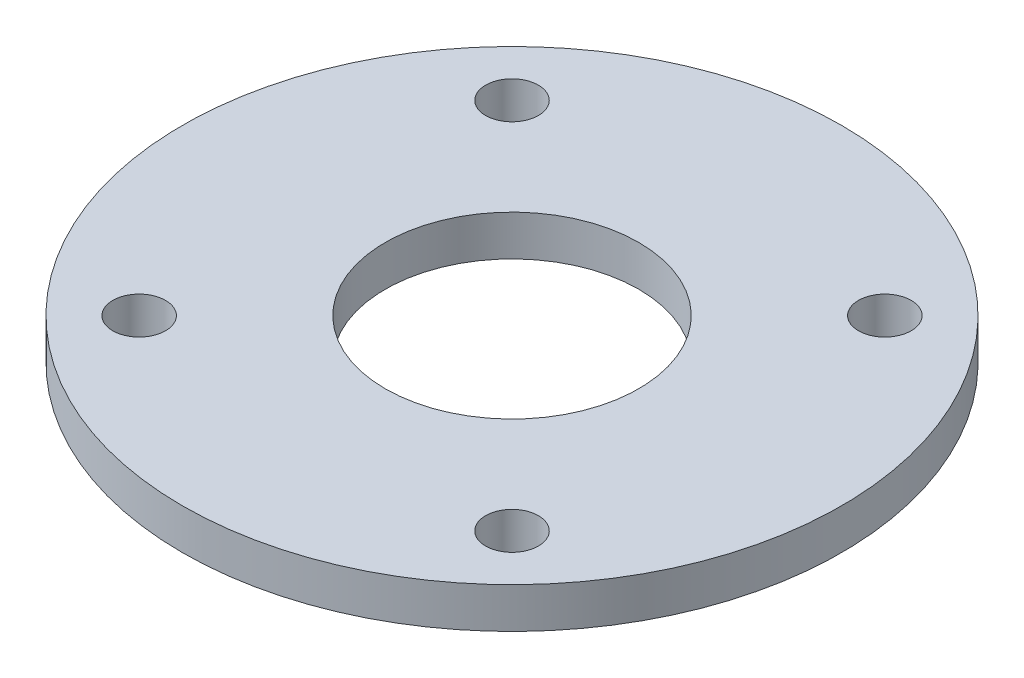
ISO-10303-21;
HEADER;
FILE_DESCRIPTION(('STEP AP214'),'2;1');
FILE_NAME('part.step','',(''),(''),'','','');
FILE_SCHEMA(('AUTOMOTIVE_DESIGN { 1 0 10303 214 1 1 1 1 }'));
ENDSEC;
DATA;
#1=APPLICATION_CONTEXT('core data for automotive mechanical design processes');
#2=APPLICATION_PROTOCOL_DEFINITION('international standard','automotive_design',2000,#1);
#3=PRODUCT_CONTEXT('',#1,'mechanical');
#4=PRODUCT('Part','Part','',(#3));
#5=PRODUCT_RELATED_PRODUCT_CATEGORY('part','',(#4));
#6=PRODUCT_DEFINITION_FORMATION('','',#4);
#7=PRODUCT_DEFINITION_CONTEXT('part definition',#1,'design');
#8=PRODUCT_DEFINITION('design','',#6,#7);
#9=PRODUCT_DEFINITION_SHAPE('','',#8);
#10=(LENGTH_UNIT() NAMED_UNIT(*) SI_UNIT(.MILLI.,.METRE.));
#11=(NAMED_UNIT(*) PLANE_ANGLE_UNIT() SI_UNIT($,.RADIAN.));
#12=(NAMED_UNIT(*) SI_UNIT($,.STERADIAN.) SOLID_ANGLE_UNIT());
#13=UNCERTAINTY_MEASURE_WITH_UNIT(LENGTH_MEASURE(1.E-05),#10,'distance_accuracy_value','');
#14=(GEOMETRIC_REPRESENTATION_CONTEXT(3) GLOBAL_UNCERTAINTY_ASSIGNED_CONTEXT((#13)) GLOBAL_UNIT_ASSIGNED_CONTEXT((#10,
#11,#12)) REPRESENTATION_CONTEXT('',''));
#15=CARTESIAN_POINT('',(0.,0.,0.));
#16=DIRECTION('',(0.,0.,1.));
#17=DIRECTION('',(1.,0.,0.));
#18=AXIS2_PLACEMENT_3D('',#15,#16,#17);
#19=CARTESIAN_POINT('',(0.,4.,0.));
#20=DIRECTION('',(0.,1.,0.));
#21=DIRECTION('',(0.,0.,1.));
#22=AXIS2_PLACEMENT_3D('',#19,#20,#21);
#23=PLANE('',#22);
#24=CARTESIAN_POINT('',(-18.3847763108502,4.,-18.3847763108502));
#25=DIRECTION('',(0.,1.,0.));
#26=DIRECTION('',(0.,0.,1.));
#27=AXIS2_PLACEMENT_3D('',#24,#25,#26);
#28=CIRCLE('',#27,2.6);
#29=CARTESIAN_POINT('',(-18.3847763108502,4.,-15.7847763108502));
#30=VERTEX_POINT('',#29);
#31=EDGE_CURVE('E61',#30,#30,#28,.T.);
#32=ORIENTED_EDGE('',*,*,#31,.F.);
#33=EDGE_LOOP('',(#32));
#34=FACE_BOUND('',#33,.T.);
#35=CARTESIAN_POINT('',(18.3847763108502,4.,18.3847763108502));
#36=DIRECTION('',(0.,1.,0.));
#37=DIRECTION('',(0.,0.,1.));
#38=AXIS2_PLACEMENT_3D('',#35,#36,#37);
#39=CIRCLE('',#38,2.6);
#40=CARTESIAN_POINT('',(18.3847763108502,4.,20.9847763108502));
#41=VERTEX_POINT('',#40);
#42=EDGE_CURVE('E49',#41,#41,#39,.T.);
#43=ORIENTED_EDGE('',*,*,#42,.F.);
#44=EDGE_LOOP('',(#43));
#45=FACE_BOUND('',#44,.T.);
#46=CARTESIAN_POINT('',(0.,4.,0.));
#47=DIRECTION('',(0.,1.,0.));
#48=DIRECTION('',(0.,0.,1.));
#49=AXIS2_PLACEMENT_3D('',#46,#47,#48);
#50=CIRCLE('',#49,32.5);
#51=CARTESIAN_POINT('',(0.,4.,32.5));
#52=VERTEX_POINT('',#51);
#53=EDGE_CURVE('E10',#52,#52,#50,.T.);
#54=ORIENTED_EDGE('',*,*,#53,.T.);
#55=EDGE_LOOP('',(#54));
#56=FACE_BOUND('',#55,.T.);
#57=CARTESIAN_POINT('',(0.,4.,0.));
#58=DIRECTION('',(0.,1.,0.));
#59=DIRECTION('',(0.,0.,1.));
#60=AXIS2_PLACEMENT_3D('',#57,#58,#59);
#61=CIRCLE('',#60,12.5);
#62=CARTESIAN_POINT('',(0.,4.,12.5));
#63=VERTEX_POINT('',#62);
#64=EDGE_CURVE('E44',#63,#63,#61,.T.);
#65=ORIENTED_EDGE('',*,*,#64,.F.);
#66=EDGE_LOOP('',(#65));
#67=FACE_BOUND('',#66,.T.);
#68=CARTESIAN_POINT('',(-18.3847763108502,4.,18.3847763108502));
#69=DIRECTION('',(0.,1.,0.));
#70=DIRECTION('',(0.,0.,1.));
#71=AXIS2_PLACEMENT_3D('',#68,#69,#70);
#72=CIRCLE('',#71,2.6);
#73=CARTESIAN_POINT('',(-18.3847763108502,4.,20.9847763108502));
#74=VERTEX_POINT('',#73);
#75=EDGE_CURVE('E55',#74,#74,#72,.T.);
#76=ORIENTED_EDGE('',*,*,#75,.F.);
#77=EDGE_LOOP('',(#76));
#78=FACE_BOUND('',#77,.T.);
#79=CARTESIAN_POINT('',(18.3847763108502,4.,-18.3847763108502));
#80=DIRECTION('',(0.,1.,0.));
#81=DIRECTION('',(0.,0.,1.));
#82=AXIS2_PLACEMENT_3D('',#79,#80,#81);
#83=CIRCLE('',#82,2.6);
#84=CARTESIAN_POINT('',(18.3847763108502,4.,-15.7847763108502));
#85=VERTEX_POINT('',#84);
#86=EDGE_CURVE('E67',#85,#85,#83,.T.);
#87=ORIENTED_EDGE('',*,*,#86,.F.);
#88=EDGE_LOOP('',(#87));
#89=FACE_BOUND('',#88,.T.);
#90=ADVANCED_FACE('F33',(#34,#45,#56,#67,#78,#89),#23,.T.);
#91=CARTESIAN_POINT('',(0.,0.,0.));
#92=DIRECTION('',(0.,1.,0.));
#93=DIRECTION('',(0.,0.,1.));
#94=AXIS2_PLACEMENT_3D('',#91,#92,#93);
#95=PLANE('',#94);
#96=CARTESIAN_POINT('',(-18.3847763108502,0.,-18.3847763108502));
#97=DIRECTION('',(0.,1.,0.));
#98=DIRECTION('',(0.,0.,1.));
#99=AXIS2_PLACEMENT_3D('',#96,#97,#98);
#100=CIRCLE('',#99,2.6);
#101=CARTESIAN_POINT('',(-18.3847763108502,0.,-15.7847763108502));
#102=VERTEX_POINT('',#101);
#103=EDGE_CURVE('E64',#102,#102,#100,.T.);
#104=ORIENTED_EDGE('',*,*,#103,.T.);
#105=EDGE_LOOP('',(#104));
#106=FACE_BOUND('',#105,.T.);
#107=CARTESIAN_POINT('',(18.3847763108502,0.,18.3847763108502));
#108=DIRECTION('',(0.,1.,0.));
#109=DIRECTION('',(0.,0.,1.));
#110=AXIS2_PLACEMENT_3D('',#107,#108,#109);
#111=CIRCLE('',#110,2.6);
#112=CARTESIAN_POINT('',(18.3847763108502,0.,20.9847763108502));
#113=VERTEX_POINT('',#112);
#114=EDGE_CURVE('E52',#113,#113,#111,.T.);
#115=ORIENTED_EDGE('',*,*,#114,.T.);
#116=EDGE_LOOP('',(#115));
#117=FACE_BOUND('',#116,.T.);
#118=CARTESIAN_POINT('',(0.,0.,0.));
#119=DIRECTION('',(0.,1.,0.));
#120=DIRECTION('',(0.,0.,1.));
#121=AXIS2_PLACEMENT_3D('',#118,#119,#120);
#122=CIRCLE('',#121,32.5);
#123=CARTESIAN_POINT('',(0.,0.,32.5));
#124=VERTEX_POINT('',#123);
#125=EDGE_CURVE('E37',#124,#124,#122,.T.);
#126=ORIENTED_EDGE('',*,*,#125,.F.);
#127=EDGE_LOOP('',(#126));
#128=FACE_BOUND('',#127,.T.);
#129=CARTESIAN_POINT('',(0.,0.,0.));
#130=DIRECTION('',(0.,1.,0.));
#131=DIRECTION('',(0.,0.,1.));
#132=AXIS2_PLACEMENT_3D('',#129,#130,#131);
#133=CIRCLE('',#132,12.5);
#134=CARTESIAN_POINT('',(0.,0.,12.5));
#135=VERTEX_POINT('',#134);
#136=EDGE_CURVE('E46',#135,#135,#133,.T.);
#137=ORIENTED_EDGE('',*,*,#136,.T.);
#138=EDGE_LOOP('',(#137));
#139=FACE_BOUND('',#138,.T.);
#140=CARTESIAN_POINT('',(-18.3847763108502,0.,18.3847763108502));
#141=DIRECTION('',(0.,1.,0.));
#142=DIRECTION('',(0.,0.,1.));
#143=AXIS2_PLACEMENT_3D('',#140,#141,#142);
#144=CIRCLE('',#143,2.6);
#145=CARTESIAN_POINT('',(-18.3847763108502,0.,20.9847763108502));
#146=VERTEX_POINT('',#145);
#147=EDGE_CURVE('E58',#146,#146,#144,.T.);
#148=ORIENTED_EDGE('',*,*,#147,.T.);
#149=EDGE_LOOP('',(#148));
#150=FACE_BOUND('',#149,.T.);
#151=CARTESIAN_POINT('',(18.3847763108502,0.,-18.3847763108502));
#152=DIRECTION('',(0.,1.,0.));
#153=DIRECTION('',(0.,0.,1.));
#154=AXIS2_PLACEMENT_3D('',#151,#152,#153);
#155=CIRCLE('',#154,2.6);
#156=CARTESIAN_POINT('',(18.3847763108502,0.,-15.7847763108502));
#157=VERTEX_POINT('',#156);
#158=EDGE_CURVE('E70',#157,#157,#155,.T.);
#159=ORIENTED_EDGE('',*,*,#158,.T.);
#160=EDGE_LOOP('',(#159));
#161=FACE_BOUND('',#160,.T.);
#162=ADVANCED_FACE('F80',(#106,#117,#128,#139,#150,#161),#95,.F.);
#163=CARTESIAN_POINT('',(0.,4.,0.));
#164=DIRECTION('',(0.,-1.,0.));
#165=DIRECTION('',(0.,0.,-1.));
#166=AXIS2_PLACEMENT_3D('',#163,#164,#165);
#167=CYLINDRICAL_SURFACE('',#166,32.5);
#168=ORIENTED_EDGE('',*,*,#53,.F.);
#169=EDGE_LOOP('',(#168));
#170=FACE_BOUND('',#169,.T.);
#171=ORIENTED_EDGE('',*,*,#125,.T.);
#172=EDGE_LOOP('',(#171));
#173=FACE_BOUND('',#172,.T.);
#174=ADVANCED_FACE('F35',(#170,#173),#167,.T.);
#175=CARTESIAN_POINT('',(0.,4.,0.));
#176=DIRECTION('',(0.,-1.,0.));
#177=DIRECTION('',(0.,0.,-1.));
#178=AXIS2_PLACEMENT_3D('',#175,#176,#177);
#179=CYLINDRICAL_SURFACE('',#178,12.5);
#180=ORIENTED_EDGE('',*,*,#64,.T.);
#181=EDGE_LOOP('',(#180));
#182=FACE_BOUND('',#181,.T.);
#183=ORIENTED_EDGE('',*,*,#136,.F.);
#184=EDGE_LOOP('',(#183));
#185=FACE_BOUND('',#184,.T.);
#186=ADVANCED_FACE('F90',(#182,#185),#179,.F.);
#187=CARTESIAN_POINT('',(18.3847763108502,4.,18.3847763108502));
#188=DIRECTION('',(0.,-1.,0.));
#189=DIRECTION('',(0.,0.,-1.));
#190=AXIS2_PLACEMENT_3D('',#187,#188,#189);
#191=CYLINDRICAL_SURFACE('',#190,2.6);
#192=ORIENTED_EDGE('',*,*,#42,.T.);
#193=EDGE_LOOP('',(#192));
#194=FACE_BOUND('',#193,.T.);
#195=ORIENTED_EDGE('',*,*,#114,.F.);
#196=EDGE_LOOP('',(#195));
#197=FACE_BOUND('',#196,.T.);
#198=ADVANCED_FACE('F93',(#194,#197),#191,.F.);
#199=CARTESIAN_POINT('',(-18.3847763108502,4.,18.3847763108502));
#200=DIRECTION('',(0.,-1.,0.));
#201=DIRECTION('',(0.,0.,-1.));
#202=AXIS2_PLACEMENT_3D('',#199,#200,#201);
#203=CYLINDRICAL_SURFACE('',#202,2.6);
#204=ORIENTED_EDGE('',*,*,#75,.T.);
#205=EDGE_LOOP('',(#204));
#206=FACE_BOUND('',#205,.T.);
#207=ORIENTED_EDGE('',*,*,#147,.F.);
#208=EDGE_LOOP('',(#207));
#209=FACE_BOUND('',#208,.T.);
#210=ADVANCED_FACE('F97',(#206,#209),#203,.F.);
#211=CARTESIAN_POINT('',(-18.3847763108502,4.,-18.3847763108502));
#212=DIRECTION('',(0.,-1.,0.));
#213=DIRECTION('',(0.,0.,-1.));
#214=AXIS2_PLACEMENT_3D('',#211,#212,#213);
#215=CYLINDRICAL_SURFACE('',#214,2.6);
#216=ORIENTED_EDGE('',*,*,#31,.T.);
#217=EDGE_LOOP('',(#216));
#218=FACE_BOUND('',#217,.T.);
#219=ORIENTED_EDGE('',*,*,#103,.F.);
#220=EDGE_LOOP('',(#219));
#221=FACE_BOUND('',#220,.T.);
#222=ADVANCED_FACE('F101',(#218,#221),#215,.F.);
#223=CARTESIAN_POINT('',(18.3847763108502,4.,-18.3847763108502));
#224=DIRECTION('',(0.,-1.,0.));
#225=DIRECTION('',(0.,0.,-1.));
#226=AXIS2_PLACEMENT_3D('',#223,#224,#225);
#227=CYLINDRICAL_SURFACE('',#226,2.6);
#228=ORIENTED_EDGE('',*,*,#86,.T.);
#229=EDGE_LOOP('',(#228));
#230=FACE_BOUND('',#229,.T.);
#231=ORIENTED_EDGE('',*,*,#158,.F.);
#232=EDGE_LOOP('',(#231));
#233=FACE_BOUND('',#232,.T.);
#234=ADVANCED_FACE('F76',(#230,#233),#227,.F.);
#235=CLOSED_SHELL('',(#90,#162,#174,#186,#198,#210,#222,#234));
#236=MANIFOLD_SOLID_BREP('B2',#235);
#237=ADVANCED_BREP_SHAPE_REPRESENTATION('',(#18,#236),#14);
#238=SHAPE_DEFINITION_REPRESENTATION(#9,#237);
ENDSEC;
END-ISO-10303-21;
